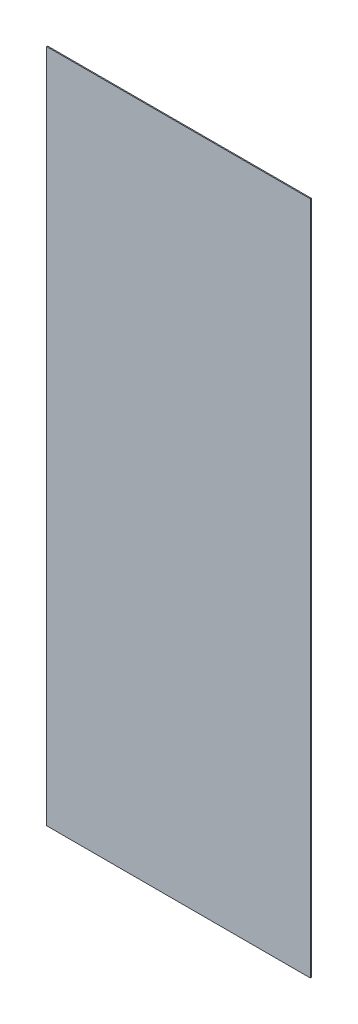
ISO-10303-21;
HEADER;
FILE_DESCRIPTION(('STEP AP214'),'2;1');
FILE_NAME('part.step','',(''),(''),'','','');
FILE_SCHEMA(('AUTOMOTIVE_DESIGN { 1 0 10303 214 1 1 1 1 }'));
ENDSEC;
DATA;
#1=APPLICATION_CONTEXT('core data for automotive mechanical design processes');
#2=APPLICATION_PROTOCOL_DEFINITION('international standard','automotive_design',2000,#1);
#3=PRODUCT_CONTEXT('',#1,'mechanical');
#4=PRODUCT('Part','Part','',(#3));
#5=PRODUCT_RELATED_PRODUCT_CATEGORY('part','',(#4));
#6=PRODUCT_DEFINITION_FORMATION('','',#4);
#7=PRODUCT_DEFINITION_CONTEXT('part definition',#1,'design');
#8=PRODUCT_DEFINITION('design','',#6,#7);
#9=PRODUCT_DEFINITION_SHAPE('','',#8);
#10=(LENGTH_UNIT() NAMED_UNIT(*) SI_UNIT(.MILLI.,.METRE.));
#11=(NAMED_UNIT(*) PLANE_ANGLE_UNIT() SI_UNIT($,.RADIAN.));
#12=(NAMED_UNIT(*) SI_UNIT($,.STERADIAN.) SOLID_ANGLE_UNIT());
#13=UNCERTAINTY_MEASURE_WITH_UNIT(LENGTH_MEASURE(1.E-05),#10,'distance_accuracy_value','');
#14=(GEOMETRIC_REPRESENTATION_CONTEXT(3) GLOBAL_UNCERTAINTY_ASSIGNED_CONTEXT((#13)) GLOBAL_UNIT_ASSIGNED_CONTEXT((#10,
#11,#12)) REPRESENTATION_CONTEXT('',''));
#15=CARTESIAN_POINT('',(0.,0.,0.));
#16=DIRECTION('',(0.,0.,1.));
#17=DIRECTION('',(1.,0.,0.));
#18=AXIS2_PLACEMENT_3D('',#15,#16,#17);
#19=CARTESIAN_POINT('',(250.,640.,1.9));
#20=DIRECTION('',(-1.,0.,0.));
#21=DIRECTION('',(0.,-1.,0.));
#22=AXIS2_PLACEMENT_3D('',#19,#20,#21);
#23=PLANE('',#22);
#24=DIRECTION('',(0.,1.,0.));
#25=VECTOR('',#24,1.);
#26=CARTESIAN_POINT('',(250.,640.,0.));
#27=LINE('',#26,#25);
#28=CARTESIAN_POINT('',(250.,-640.,0.));
#29=VERTEX_POINT('',#28);
#30=CARTESIAN_POINT('',(250.,640.,0.));
#31=VERTEX_POINT('',#30);
#32=EDGE_CURVE('E95',#29,#31,#27,.T.);
#33=ORIENTED_EDGE('',*,*,#32,.T.);
#34=DIRECTION('',(0.,0.,-1.));
#35=VECTOR('',#34,1.);
#36=CARTESIAN_POINT('',(250.,640.,1.9));
#37=LINE('',#36,#35);
#38=CARTESIAN_POINT('',(250.,640.,1.9));
#39=VERTEX_POINT('',#38);
#40=EDGE_CURVE('E11',#39,#31,#37,.T.);
#41=ORIENTED_EDGE('',*,*,#40,.F.);
#42=DIRECTION('',(0.,1.,0.));
#43=VECTOR('',#42,1.);
#44=CARTESIAN_POINT('',(250.,640.,1.9));
#45=LINE('',#44,#43);
#46=CARTESIAN_POINT('',(250.,-640.,1.9));
#47=VERTEX_POINT('',#46);
#48=EDGE_CURVE('E83',#47,#39,#45,.T.);
#49=ORIENTED_EDGE('',*,*,#48,.F.);
#50=DIRECTION('',(0.,0.,-1.));
#51=VECTOR('',#50,1.);
#52=CARTESIAN_POINT('',(250.,-640.,1.9));
#53=LINE('',#52,#51);
#54=EDGE_CURVE('E91',#47,#29,#53,.T.);
#55=ORIENTED_EDGE('',*,*,#54,.T.);
#56=EDGE_LOOP('',(#33,#41,#49,#55));
#57=FACE_BOUND('',#56,.T.);
#58=ADVANCED_FACE('F32',(#57),#23,.F.);
#59=CARTESIAN_POINT('',(-250.,640.,1.9));
#60=DIRECTION('',(0.,-1.,0.));
#61=DIRECTION('',(0.,0.,-1.));
#62=AXIS2_PLACEMENT_3D('',#59,#60,#61);
#63=PLANE('',#62);
#64=DIRECTION('',(-1.,0.,0.));
#65=VECTOR('',#64,1.);
#66=CARTESIAN_POINT('',(-250.,640.,0.));
#67=LINE('',#66,#65);
#68=CARTESIAN_POINT('',(-250.,640.,0.));
#69=VERTEX_POINT('',#68);
#70=EDGE_CURVE('E87',#31,#69,#67,.T.);
#71=ORIENTED_EDGE('',*,*,#70,.T.);
#72=DIRECTION('',(0.,0.,-1.));
#73=VECTOR('',#72,1.);
#74=CARTESIAN_POINT('',(-250.,640.,1.9));
#75=LINE('',#74,#73);
#76=CARTESIAN_POINT('',(-250.,640.,1.9));
#77=VERTEX_POINT('',#76);
#78=EDGE_CURVE('E40',#77,#69,#75,.T.);
#79=ORIENTED_EDGE('',*,*,#78,.F.);
#80=DIRECTION('',(-1.,0.,0.));
#81=VECTOR('',#80,1.);
#82=CARTESIAN_POINT('',(-250.,640.,1.9));
#83=LINE('',#82,#81);
#84=EDGE_CURVE('E78',#39,#77,#83,.T.);
#85=ORIENTED_EDGE('',*,*,#84,.F.);
#86=ORIENTED_EDGE('',*,*,#40,.T.);
#87=EDGE_LOOP('',(#71,#79,#85,#86));
#88=FACE_BOUND('',#87,.T.);
#89=ADVANCED_FACE('F86',(#88),#63,.F.);
#90=CARTESIAN_POINT('',(-250.,640.,1.9));
#91=DIRECTION('',(1.,0.,0.));
#92=DIRECTION('',(0.,1.,0.));
#93=AXIS2_PLACEMENT_3D('',#90,#91,#92);
#94=PLANE('',#93);
#95=DIRECTION('',(0.,-1.,0.));
#96=VECTOR('',#95,1.);
#97=CARTESIAN_POINT('',(-250.,640.,0.));
#98=LINE('',#97,#96);
#99=CARTESIAN_POINT('',(-250.,-640.,0.));
#100=VERTEX_POINT('',#99);
#101=EDGE_CURVE('E65',#69,#100,#98,.T.);
#102=ORIENTED_EDGE('',*,*,#101,.T.);
#103=DIRECTION('',(0.,0.,-1.));
#104=VECTOR('',#103,1.);
#105=CARTESIAN_POINT('',(-250.,-640.,1.9));
#106=LINE('',#105,#104);
#107=CARTESIAN_POINT('',(-250.,-640.,1.9));
#108=VERTEX_POINT('',#107);
#109=EDGE_CURVE('E88',#108,#100,#106,.T.);
#110=ORIENTED_EDGE('',*,*,#109,.F.);
#111=DIRECTION('',(0.,-1.,0.));
#112=VECTOR('',#111,1.);
#113=CARTESIAN_POINT('',(-250.,640.,1.9));
#114=LINE('',#113,#112);
#115=EDGE_CURVE('E81',#77,#108,#114,.T.);
#116=ORIENTED_EDGE('',*,*,#115,.F.);
#117=ORIENTED_EDGE('',*,*,#78,.T.);
#118=EDGE_LOOP('',(#102,#110,#116,#117));
#119=FACE_BOUND('',#118,.T.);
#120=ADVANCED_FACE('F89',(#119),#94,.F.);
#121=CARTESIAN_POINT('',(-250.,-640.,1.9));
#122=DIRECTION('',(0.,1.,0.));
#123=DIRECTION('',(0.,0.,1.));
#124=AXIS2_PLACEMENT_3D('',#121,#122,#123);
#125=PLANE('',#124);
#126=DIRECTION('',(1.,0.,0.));
#127=VECTOR('',#126,1.);
#128=CARTESIAN_POINT('',(-250.,-640.,0.));
#129=LINE('',#128,#127);
#130=EDGE_CURVE('E71',#100,#29,#129,.T.);
#131=ORIENTED_EDGE('',*,*,#130,.T.);
#132=ORIENTED_EDGE('',*,*,#54,.F.);
#133=DIRECTION('',(1.,0.,0.));
#134=VECTOR('',#133,1.);
#135=CARTESIAN_POINT('',(-250.,-640.,1.9));
#136=LINE('',#135,#134);
#137=EDGE_CURVE('E48',#108,#47,#136,.T.);
#138=ORIENTED_EDGE('',*,*,#137,.F.);
#139=ORIENTED_EDGE('',*,*,#109,.T.);
#140=EDGE_LOOP('',(#131,#132,#138,#139));
#141=FACE_BOUND('',#140,.T.);
#142=ADVANCED_FACE('F102',(#141),#125,.F.);
#143=CARTESIAN_POINT('',(0.,0.,1.9));
#144=DIRECTION('',(0.,0.,1.));
#145=DIRECTION('',(1.,0.,0.));
#146=AXIS2_PLACEMENT_3D('',#143,#144,#145);
#147=PLANE('',#146);
#148=ORIENTED_EDGE('',*,*,#48,.T.);
#149=ORIENTED_EDGE('',*,*,#84,.T.);
#150=ORIENTED_EDGE('',*,*,#115,.T.);
#151=ORIENTED_EDGE('',*,*,#137,.T.);
#152=EDGE_LOOP('',(#148,#149,#150,#151));
#153=FACE_BOUND('',#152,.T.);
#154=ADVANCED_FACE('F79',(#153),#147,.T.);
#155=CARTESIAN_POINT('',(0.,0.,0.));
#156=DIRECTION('',(0.,0.,1.));
#157=DIRECTION('',(1.,0.,0.));
#158=AXIS2_PLACEMENT_3D('',#155,#156,#157);
#159=PLANE('',#158);
#160=ORIENTED_EDGE('',*,*,#32,.F.);
#161=ORIENTED_EDGE('',*,*,#130,.F.);
#162=ORIENTED_EDGE('',*,*,#101,.F.);
#163=ORIENTED_EDGE('',*,*,#70,.F.);
#164=EDGE_LOOP('',(#160,#161,#162,#163));
#165=FACE_BOUND('',#164,.T.);
#166=ADVANCED_FACE('F105',(#165),#159,.F.);
#167=CLOSED_SHELL('',(#58,#89,#120,#142,#154,#166));
#168=MANIFOLD_SOLID_BREP('B2',#167);
#169=ADVANCED_BREP_SHAPE_REPRESENTATION('',(#18,#168),#14);
#170=SHAPE_DEFINITION_REPRESENTATION(#9,#169);
ENDSEC;
END-ISO-10303-21;
